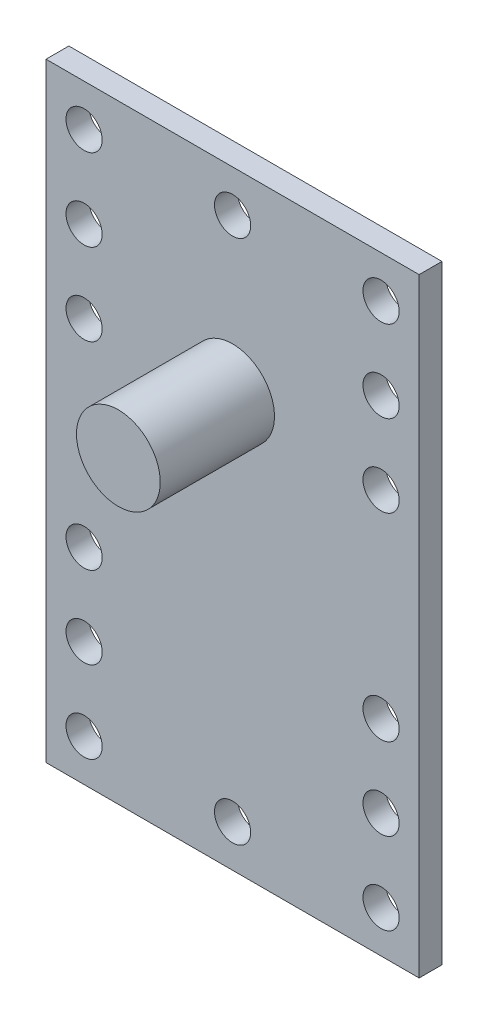
ISO-10303-21;
HEADER;
FILE_DESCRIPTION(('STEP AP214'),'2;1');
FILE_NAME('part.step','',(''),(''),'','','');
FILE_SCHEMA(('AUTOMOTIVE_DESIGN { 1 0 10303 214 1 1 1 1 }'));
ENDSEC;
DATA;
#1=APPLICATION_CONTEXT('core data for automotive mechanical design processes');
#2=APPLICATION_PROTOCOL_DEFINITION('international standard','automotive_design',2000,#1);
#3=PRODUCT_CONTEXT('',#1,'mechanical');
#4=PRODUCT('Part','Part','',(#3));
#5=PRODUCT_RELATED_PRODUCT_CATEGORY('part','',(#4));
#6=PRODUCT_DEFINITION_FORMATION('','',#4);
#7=PRODUCT_DEFINITION_CONTEXT('part definition',#1,'design');
#8=PRODUCT_DEFINITION('design','',#6,#7);
#9=PRODUCT_DEFINITION_SHAPE('','',#8);
#10=(LENGTH_UNIT() NAMED_UNIT(*) SI_UNIT(.MILLI.,.METRE.));
#11=(NAMED_UNIT(*) PLANE_ANGLE_UNIT() SI_UNIT($,.RADIAN.));
#12=(NAMED_UNIT(*) SI_UNIT($,.STERADIAN.) SOLID_ANGLE_UNIT());
#13=UNCERTAINTY_MEASURE_WITH_UNIT(LENGTH_MEASURE(1.E-05),#10,'distance_accuracy_value','');
#14=(GEOMETRIC_REPRESENTATION_CONTEXT(3) GLOBAL_UNCERTAINTY_ASSIGNED_CONTEXT((#13)) GLOBAL_UNIT_ASSIGNED_CONTEXT((#10,
#11,#12)) REPRESENTATION_CONTEXT('',''));
#15=CARTESIAN_POINT('',(0.,0.,0.));
#16=DIRECTION('',(0.,0.,1.));
#17=DIRECTION('',(1.,0.,0.));
#18=AXIS2_PLACEMENT_3D('',#15,#16,#17);
#19=CARTESIAN_POINT('',(0.,0.,0.));
#20=DIRECTION('',(0.,0.,-1.));
#21=DIRECTION('',(-1.,0.,0.));
#22=AXIS2_PLACEMENT_3D('',#19,#20,#21);
#23=PLANE('',#22);
#24=CARTESIAN_POINT('',(-7.8,5.2,0.));
#25=DIRECTION('',(0.,0.,1.));
#26=DIRECTION('',(-1.,0.,0.));
#27=AXIS2_PLACEMENT_3D('',#24,#25,#26);
#28=CIRCLE('',#27,0.949999999999999);
#29=CARTESIAN_POINT('',(-8.75,5.2,0.));
#30=VERTEX_POINT('',#29);
#31=EDGE_CURVE('E150',#30,#30,#28,.T.);
#32=ORIENTED_EDGE('',*,*,#31,.F.);
#33=EDGE_LOOP('',(#32));
#34=FACE_BOUND('',#33,.T.);
#35=CARTESIAN_POINT('',(-7.8,13.8,0.));
#36=DIRECTION('',(0.,0.,1.));
#37=DIRECTION('',(-1.,0.,0.));
#38=AXIS2_PLACEMENT_3D('',#35,#36,#37);
#39=CIRCLE('',#38,0.949999999999999);
#40=CARTESIAN_POINT('',(-8.75,13.8,0.));
#41=VERTEX_POINT('',#40);
#42=EDGE_CURVE('E164',#41,#41,#39,.T.);
#43=ORIENTED_EDGE('',*,*,#42,.F.);
#44=EDGE_LOOP('',(#43));
#45=FACE_BOUND('',#44,.T.);
#46=CARTESIAN_POINT('',(7.8,5.2,0.));
#47=DIRECTION('',(0.,0.,-1.));
#48=DIRECTION('',(1.,0.,0.));
#49=AXIS2_PLACEMENT_3D('',#46,#47,#48);
#50=CIRCLE('',#49,0.949999999999999);
#51=CARTESIAN_POINT('',(8.75,5.2,0.));
#52=VERTEX_POINT('',#51);
#53=EDGE_CURVE('E168',#52,#52,#50,.T.);
#54=ORIENTED_EDGE('',*,*,#53,.T.);
#55=EDGE_LOOP('',(#54));
#56=FACE_BOUND('',#55,.T.);
#57=CARTESIAN_POINT('',(7.8,9.5,0.));
#58=DIRECTION('',(0.,0.,-1.));
#59=DIRECTION('',(1.,0.,0.));
#60=AXIS2_PLACEMENT_3D('',#57,#58,#59);
#61=CIRCLE('',#60,0.949999999999999);
#62=CARTESIAN_POINT('',(8.75,9.5,0.));
#63=VERTEX_POINT('',#62);
#64=EDGE_CURVE('E172',#63,#63,#61,.T.);
#65=ORIENTED_EDGE('',*,*,#64,.T.);
#66=EDGE_LOOP('',(#65));
#67=FACE_BOUND('',#66,.T.);
#68=CARTESIAN_POINT('',(7.8,13.8,0.));
#69=DIRECTION('',(0.,0.,-1.));
#70=DIRECTION('',(1.,0.,0.));
#71=AXIS2_PLACEMENT_3D('',#68,#69,#70);
#72=CIRCLE('',#71,0.949999999999999);
#73=CARTESIAN_POINT('',(8.75,13.8,0.));
#74=VERTEX_POINT('',#73);
#75=EDGE_CURVE('E176',#74,#74,#72,.T.);
#76=ORIENTED_EDGE('',*,*,#75,.T.);
#77=EDGE_LOOP('',(#76));
#78=FACE_BOUND('',#77,.T.);
#79=CARTESIAN_POINT('',(7.8,-9.5,0.));
#80=DIRECTION('',(0.,0.,1.));
#81=DIRECTION('',(1.,0.,0.));
#82=AXIS2_PLACEMENT_3D('',#79,#80,#81);
#83=CIRCLE('',#82,0.949999999999999);
#84=CARTESIAN_POINT('',(8.75,-9.5,0.));
#85=VERTEX_POINT('',#84);
#86=EDGE_CURVE('E186',#85,#85,#83,.T.);
#87=ORIENTED_EDGE('',*,*,#86,.F.);
#88=EDGE_LOOP('',(#87));
#89=FACE_BOUND('',#88,.T.);
#90=CARTESIAN_POINT('',(-7.8,-5.2,0.));
#91=DIRECTION('',(0.,0.,-1.));
#92=DIRECTION('',(-1.,0.,0.));
#93=AXIS2_PLACEMENT_3D('',#90,#91,#92);
#94=CIRCLE('',#93,0.949999999999999);
#95=CARTESIAN_POINT('',(-8.75,-5.2,0.));
#96=VERTEX_POINT('',#95);
#97=EDGE_CURVE('E114',#96,#96,#94,.T.);
#98=ORIENTED_EDGE('',*,*,#97,.T.);
#99=EDGE_LOOP('',(#98));
#100=FACE_BOUND('',#99,.T.);
#101=DIRECTION('',(0.,1.,0.));
#102=VECTOR('',#101,1.);
#103=CARTESIAN_POINT('',(9.8,-16.,0.));
#104=LINE('',#103,#102);
#105=CARTESIAN_POINT('',(9.8,-16.,0.));
#106=VERTEX_POINT('',#105);
#107=CARTESIAN_POINT('',(9.8,16.,0.));
#108=VERTEX_POINT('',#107);
#109=EDGE_CURVE('E104',#106,#108,#104,.T.);
#110=ORIENTED_EDGE('',*,*,#109,.T.);
#111=DIRECTION('',(-1.,0.,0.));
#112=VECTOR('',#111,1.);
#113=CARTESIAN_POINT('',(-9.8,16.,0.));
#114=LINE('',#113,#112);
#115=CARTESIAN_POINT('',(-9.8,16.,0.));
#116=VERTEX_POINT('',#115);
#117=EDGE_CURVE('E107',#108,#116,#114,.T.);
#118=ORIENTED_EDGE('',*,*,#117,.T.);
#119=DIRECTION('',(0.,-1.,0.));
#120=VECTOR('',#119,1.);
#121=CARTESIAN_POINT('',(-9.8,-16.,0.));
#122=LINE('',#121,#120);
#123=CARTESIAN_POINT('',(-9.8,-16.,0.));
#124=VERTEX_POINT('',#123);
#125=EDGE_CURVE('E87',#116,#124,#122,.T.);
#126=ORIENTED_EDGE('',*,*,#125,.T.);
#127=DIRECTION('',(1.,0.,0.));
#128=VECTOR('',#127,1.);
#129=CARTESIAN_POINT('',(-9.8,-16.,0.));
#130=LINE('',#129,#128);
#131=EDGE_CURVE('E99',#124,#106,#130,.T.);
#132=ORIENTED_EDGE('',*,*,#131,.T.);
#133=EDGE_LOOP('',(#110,#118,#126,#132));
#134=FACE_BOUND('',#133,.T.);
#135=CARTESIAN_POINT('',(0.,13.8,0.));
#136=DIRECTION('',(0.,0.,-1.));
#137=DIRECTION('',(-1.,0.,0.));
#138=AXIS2_PLACEMENT_3D('',#135,#136,#137);
#139=CIRCLE('',#138,0.95);
#140=CARTESIAN_POINT('',(-0.95,13.8,0.));
#141=VERTEX_POINT('',#140);
#142=EDGE_CURVE('E108',#141,#141,#139,.T.);
#143=ORIENTED_EDGE('',*,*,#142,.T.);
#144=EDGE_LOOP('',(#143));
#145=FACE_BOUND('',#144,.T.);
#146=CARTESIAN_POINT('',(0.,-13.8,0.));
#147=DIRECTION('',(0.,0.,-1.));
#148=DIRECTION('',(-1.,0.,0.));
#149=AXIS2_PLACEMENT_3D('',#146,#147,#148);
#150=CIRCLE('',#149,0.949999999999999);
#151=CARTESIAN_POINT('',(-0.949999999999999,-13.8,0.));
#152=VERTEX_POINT('',#151);
#153=EDGE_CURVE('E209',#152,#152,#150,.T.);
#154=ORIENTED_EDGE('',*,*,#153,.T.);
#155=EDGE_LOOP('',(#154));
#156=FACE_BOUND('',#155,.T.);
#157=CARTESIAN_POINT('',(-7.8,-13.8,0.));
#158=DIRECTION('',(0.,0.,-1.));
#159=DIRECTION('',(-1.,0.,0.));
#160=AXIS2_PLACEMENT_3D('',#157,#158,#159);
#161=CIRCLE('',#160,0.949999999999999);
#162=CARTESIAN_POINT('',(-8.75,-13.8,0.));
#163=VERTEX_POINT('',#162);
#164=EDGE_CURVE('E203',#163,#163,#161,.T.);
#165=ORIENTED_EDGE('',*,*,#164,.T.);
#166=EDGE_LOOP('',(#165));
#167=FACE_BOUND('',#166,.T.);
#168=CARTESIAN_POINT('',(-7.8,-9.5,0.));
#169=DIRECTION('',(0.,0.,-1.));
#170=DIRECTION('',(-1.,0.,0.));
#171=AXIS2_PLACEMENT_3D('',#168,#169,#170);
#172=CIRCLE('',#171,0.949999999999999);
#173=CARTESIAN_POINT('',(-8.75,-9.5,0.));
#174=VERTEX_POINT('',#173);
#175=EDGE_CURVE('E194',#174,#174,#172,.T.);
#176=ORIENTED_EDGE('',*,*,#175,.T.);
#177=EDGE_LOOP('',(#176));
#178=FACE_BOUND('',#177,.T.);
#179=CARTESIAN_POINT('',(7.8,-13.8,0.));
#180=DIRECTION('',(0.,0.,1.));
#181=DIRECTION('',(1.,0.,0.));
#182=AXIS2_PLACEMENT_3D('',#179,#180,#181);
#183=CIRCLE('',#182,0.949999999999999);
#184=CARTESIAN_POINT('',(8.75,-13.8,0.));
#185=VERTEX_POINT('',#184);
#186=EDGE_CURVE('E191',#185,#185,#183,.T.);
#187=ORIENTED_EDGE('',*,*,#186,.F.);
#188=EDGE_LOOP('',(#187));
#189=FACE_BOUND('',#188,.T.);
#190=CARTESIAN_POINT('',(7.8,-5.2,0.));
#191=DIRECTION('',(0.,0.,1.));
#192=DIRECTION('',(1.,0.,0.));
#193=AXIS2_PLACEMENT_3D('',#190,#191,#192);
#194=CIRCLE('',#193,0.949999999999999);
#195=CARTESIAN_POINT('',(8.75,-5.2,0.));
#196=VERTEX_POINT('',#195);
#197=EDGE_CURVE('E181',#196,#196,#194,.T.);
#198=ORIENTED_EDGE('',*,*,#197,.F.);
#199=EDGE_LOOP('',(#198));
#200=FACE_BOUND('',#199,.T.);
#201=CARTESIAN_POINT('',(-7.8,9.5,0.));
#202=DIRECTION('',(0.,0.,1.));
#203=DIRECTION('',(-1.,0.,0.));
#204=AXIS2_PLACEMENT_3D('',#201,#202,#203);
#205=CIRCLE('',#204,0.949999999999999);
#206=CARTESIAN_POINT('',(-8.75,9.5,0.));
#207=VERTEX_POINT('',#206);
#208=EDGE_CURVE('E159',#207,#207,#205,.T.);
#209=ORIENTED_EDGE('',*,*,#208,.F.);
#210=EDGE_LOOP('',(#209));
#211=FACE_BOUND('',#210,.T.);
#212=CARTESIAN_POINT('',(0.,5.75,0.));
#213=DIRECTION('',(0.,0.,-1.));
#214=DIRECTION('',(-1.,0.,0.));
#215=AXIS2_PLACEMENT_3D('',#212,#213,#214);
#216=CIRCLE('',#215,2.2);
#217=CARTESIAN_POINT('',(-2.2,5.75,0.));
#218=VERTEX_POINT('',#217);
#219=EDGE_CURVE('E11',#218,#218,#216,.F.);
#220=ORIENTED_EDGE('',*,*,#219,.F.);
#221=EDGE_LOOP('',(#220));
#222=FACE_BOUND('',#221,.T.);
#223=ADVANCED_FACE('F34',(#34,#45,#56,#67,#78,#89,#100,#134,#145,#156,#167,#178,#189,#200,#211,
#222),#23,.F.);
#224=CARTESIAN_POINT('',(0.,0.,-1.2));
#225=DIRECTION('',(0.,0.,-1.));
#226=DIRECTION('',(-1.,0.,0.));
#227=AXIS2_PLACEMENT_3D('',#224,#225,#226);
#228=PLANE('',#227);
#229=CARTESIAN_POINT('',(-7.8,9.5,-1.2));
#230=DIRECTION('',(0.,0.,1.));
#231=DIRECTION('',(-1.,0.,0.));
#232=AXIS2_PLACEMENT_3D('',#229,#230,#231);
#233=CIRCLE('',#232,0.949999999999999);
#234=CARTESIAN_POINT('',(-8.75,9.5,-1.2));
#235=VERTEX_POINT('',#234);
#236=EDGE_CURVE('E154',#235,#235,#233,.T.);
#237=ORIENTED_EDGE('',*,*,#236,.T.);
#238=EDGE_LOOP('',(#237));
#239=FACE_BOUND('',#238,.T.);
#240=CARTESIAN_POINT('',(7.8,-5.2,-1.2));
#241=DIRECTION('',(0.,0.,1.));
#242=DIRECTION('',(1.,0.,0.));
#243=AXIS2_PLACEMENT_3D('',#240,#241,#242);
#244=CIRCLE('',#243,0.949999999999999);
#245=CARTESIAN_POINT('',(8.75,-5.2,-1.2));
#246=VERTEX_POINT('',#245);
#247=EDGE_CURVE('E179',#246,#246,#244,.T.);
#248=ORIENTED_EDGE('',*,*,#247,.T.);
#249=EDGE_LOOP('',(#248));
#250=FACE_BOUND('',#249,.T.);
#251=CARTESIAN_POINT('',(7.8,-13.8,-1.2));
#252=DIRECTION('',(0.,0.,1.));
#253=DIRECTION('',(1.,0.,0.));
#254=AXIS2_PLACEMENT_3D('',#251,#252,#253);
#255=CIRCLE('',#254,0.949999999999999);
#256=CARTESIAN_POINT('',(8.75,-13.8,-1.2));
#257=VERTEX_POINT('',#256);
#258=EDGE_CURVE('E189',#257,#257,#255,.T.);
#259=ORIENTED_EDGE('',*,*,#258,.T.);
#260=EDGE_LOOP('',(#259));
#261=FACE_BOUND('',#260,.T.);
#262=CARTESIAN_POINT('',(-7.8,-9.5,-1.2));
#263=DIRECTION('',(0.,0.,-1.));
#264=DIRECTION('',(-1.,0.,0.));
#265=AXIS2_PLACEMENT_3D('',#262,#263,#264);
#266=CIRCLE('',#265,0.949999999999999);
#267=CARTESIAN_POINT('',(-8.75,-9.5,-1.2));
#268=VERTEX_POINT('',#267);
#269=EDGE_CURVE('E199',#268,#268,#266,.T.);
#270=ORIENTED_EDGE('',*,*,#269,.F.);
#271=EDGE_LOOP('',(#270));
#272=FACE_BOUND('',#271,.T.);
#273=CARTESIAN_POINT('',(-7.8,-13.8,-1.2));
#274=DIRECTION('',(0.,0.,-1.));
#275=DIRECTION('',(-1.,0.,0.));
#276=AXIS2_PLACEMENT_3D('',#273,#274,#275);
#277=CIRCLE('',#276,0.949999999999999);
#278=CARTESIAN_POINT('',(-8.75,-13.8,-1.2));
#279=VERTEX_POINT('',#278);
#280=EDGE_CURVE('E202',#279,#279,#277,.T.);
#281=ORIENTED_EDGE('',*,*,#280,.F.);
#282=EDGE_LOOP('',(#281));
#283=FACE_BOUND('',#282,.T.);
#284=CARTESIAN_POINT('',(0.,-13.8,-1.2));
#285=DIRECTION('',(0.,0.,-1.));
#286=DIRECTION('',(-1.,0.,0.));
#287=AXIS2_PLACEMENT_3D('',#284,#285,#286);
#288=CIRCLE('',#287,0.949999999999999);
#289=CARTESIAN_POINT('',(-0.949999999999999,-13.8,-1.2));
#290=VERTEX_POINT('',#289);
#291=EDGE_CURVE('E206',#290,#290,#288,.T.);
#292=ORIENTED_EDGE('',*,*,#291,.F.);
#293=EDGE_LOOP('',(#292));
#294=FACE_BOUND('',#293,.T.);
#295=CARTESIAN_POINT('',(0.,13.8,-1.2));
#296=DIRECTION('',(0.,0.,-1.));
#297=DIRECTION('',(-1.,0.,0.));
#298=AXIS2_PLACEMENT_3D('',#295,#296,#297);
#299=CIRCLE('',#298,0.95);
#300=CARTESIAN_POINT('',(-0.95,13.8,-1.2));
#301=VERTEX_POINT('',#300);
#302=EDGE_CURVE('E212',#301,#301,#299,.T.);
#303=ORIENTED_EDGE('',*,*,#302,.F.);
#304=EDGE_LOOP('',(#303));
#305=FACE_BOUND('',#304,.T.);
#306=DIRECTION('',(0.,1.,0.));
#307=VECTOR('',#306,1.);
#308=CARTESIAN_POINT('',(9.8,-16.,-1.2));
#309=LINE('',#308,#307);
#310=CARTESIAN_POINT('',(9.8,-16.,-1.2));
#311=VERTEX_POINT('',#310);
#312=CARTESIAN_POINT('',(9.8,16.,-1.2));
#313=VERTEX_POINT('',#312);
#314=EDGE_CURVE('E97',#311,#313,#309,.T.);
#315=ORIENTED_EDGE('',*,*,#314,.F.);
#316=DIRECTION('',(1.,0.,0.));
#317=VECTOR('',#316,1.);
#318=CARTESIAN_POINT('',(-9.8,-16.,-1.2));
#319=LINE('',#318,#317);
#320=CARTESIAN_POINT('',(-9.8,-16.,-1.2));
#321=VERTEX_POINT('',#320);
#322=EDGE_CURVE('E94',#321,#311,#319,.T.);
#323=ORIENTED_EDGE('',*,*,#322,.F.);
#324=DIRECTION('',(0.,-1.,0.));
#325=VECTOR('',#324,1.);
#326=CARTESIAN_POINT('',(-9.8,-16.,-1.2));
#327=LINE('',#326,#325);
#328=CARTESIAN_POINT('',(-9.8,16.,-1.2));
#329=VERTEX_POINT('',#328);
#330=EDGE_CURVE('E85',#329,#321,#327,.T.);
#331=ORIENTED_EDGE('',*,*,#330,.F.);
#332=DIRECTION('',(-1.,0.,0.));
#333=VECTOR('',#332,1.);
#334=CARTESIAN_POINT('',(-9.8,16.,-1.2));
#335=LINE('',#334,#333);
#336=EDGE_CURVE('E93',#313,#329,#335,.T.);
#337=ORIENTED_EDGE('',*,*,#336,.F.);
#338=EDGE_LOOP('',(#315,#323,#331,#337));
#339=FACE_BOUND('',#338,.T.);
#340=CARTESIAN_POINT('',(-7.8,-5.2,-1.2));
#341=DIRECTION('',(0.,0.,-1.));
#342=DIRECTION('',(-1.,0.,0.));
#343=AXIS2_PLACEMENT_3D('',#340,#341,#342);
#344=CIRCLE('',#343,0.949999999999999);
#345=CARTESIAN_POINT('',(-8.75,-5.2,-1.2));
#346=VERTEX_POINT('',#345);
#347=EDGE_CURVE('E43',#346,#346,#344,.T.);
#348=ORIENTED_EDGE('',*,*,#347,.F.);
#349=EDGE_LOOP('',(#348));
#350=FACE_BOUND('',#349,.T.);
#351=CARTESIAN_POINT('',(7.8,-9.5,-1.2));
#352=DIRECTION('',(0.,0.,1.));
#353=DIRECTION('',(1.,0.,0.));
#354=AXIS2_PLACEMENT_3D('',#351,#352,#353);
#355=CIRCLE('',#354,0.949999999999999);
#356=CARTESIAN_POINT('',(8.75,-9.5,-1.2));
#357=VERTEX_POINT('',#356);
#358=EDGE_CURVE('E129',#357,#357,#355,.T.);
#359=ORIENTED_EDGE('',*,*,#358,.T.);
#360=EDGE_LOOP('',(#359));
#361=FACE_BOUND('',#360,.T.);
#362=CARTESIAN_POINT('',(7.8,13.8,-1.2));
#363=DIRECTION('',(0.,0.,-1.));
#364=DIRECTION('',(1.,0.,0.));
#365=AXIS2_PLACEMENT_3D('',#362,#363,#364);
#366=CIRCLE('',#365,0.949999999999999);
#367=CARTESIAN_POINT('',(8.75,13.8,-1.2));
#368=VERTEX_POINT('',#367);
#369=EDGE_CURVE('E133',#368,#368,#366,.T.);
#370=ORIENTED_EDGE('',*,*,#369,.F.);
#371=EDGE_LOOP('',(#370));
#372=FACE_BOUND('',#371,.T.);
#373=CARTESIAN_POINT('',(7.8,9.5,-1.2));
#374=DIRECTION('',(0.,0.,-1.));
#375=DIRECTION('',(1.,0.,0.));
#376=AXIS2_PLACEMENT_3D('',#373,#374,#375);
#377=CIRCLE('',#376,0.949999999999999);
#378=CARTESIAN_POINT('',(8.75,9.5,-1.2));
#379=VERTEX_POINT('',#378);
#380=EDGE_CURVE('E137',#379,#379,#377,.T.);
#381=ORIENTED_EDGE('',*,*,#380,.F.);
#382=EDGE_LOOP('',(#381));
#383=FACE_BOUND('',#382,.T.);
#384=CARTESIAN_POINT('',(7.8,5.2,-1.2));
#385=DIRECTION('',(0.,0.,-1.));
#386=DIRECTION('',(1.,0.,0.));
#387=AXIS2_PLACEMENT_3D('',#384,#385,#386);
#388=CIRCLE('',#387,0.949999999999999);
#389=CARTESIAN_POINT('',(8.75,5.2,-1.2));
#390=VERTEX_POINT('',#389);
#391=EDGE_CURVE('E141',#390,#390,#388,.T.);
#392=ORIENTED_EDGE('',*,*,#391,.F.);
#393=EDGE_LOOP('',(#392));
#394=FACE_BOUND('',#393,.T.);
#395=CARTESIAN_POINT('',(-7.8,13.8,-1.2));
#396=DIRECTION('',(0.,0.,1.));
#397=DIRECTION('',(-1.,0.,0.));
#398=AXIS2_PLACEMENT_3D('',#395,#396,#397);
#399=CIRCLE('',#398,0.949999999999999);
#400=CARTESIAN_POINT('',(-8.75,13.8,-1.2));
#401=VERTEX_POINT('',#400);
#402=EDGE_CURVE('E145',#401,#401,#399,.T.);
#403=ORIENTED_EDGE('',*,*,#402,.T.);
#404=EDGE_LOOP('',(#403));
#405=FACE_BOUND('',#404,.T.);
#406=CARTESIAN_POINT('',(-7.8,5.2,-1.2));
#407=DIRECTION('',(0.,0.,1.));
#408=DIRECTION('',(-1.,0.,0.));
#409=AXIS2_PLACEMENT_3D('',#406,#407,#408);
#410=CIRCLE('',#409,0.949999999999999);
#411=CARTESIAN_POINT('',(-8.75,5.2,-1.2));
#412=VERTEX_POINT('',#411);
#413=EDGE_CURVE('E148',#412,#412,#410,.T.);
#414=ORIENTED_EDGE('',*,*,#413,.T.);
#415=EDGE_LOOP('',(#414));
#416=FACE_BOUND('',#415,.T.);
#417=ADVANCED_FACE('F91',(#239,#250,#261,#272,#283,#294,#305,#339,#350,#361,#372,#383,#394,#405,
#416),#228,.T.);
#418=CARTESIAN_POINT('',(9.8,-16.,-1.2));
#419=DIRECTION('',(1.,0.,0.));
#420=DIRECTION('',(0.,0.,-1.));
#421=AXIS2_PLACEMENT_3D('',#418,#419,#420);
#422=PLANE('',#421);
#423=ORIENTED_EDGE('',*,*,#109,.F.);
#424=DIRECTION('',(0.,0.,1.));
#425=VECTOR('',#424,1.);
#426=CARTESIAN_POINT('',(9.8,-16.,-1.2));
#427=LINE('',#426,#425);
#428=EDGE_CURVE('E51',#311,#106,#427,.T.);
#429=ORIENTED_EDGE('',*,*,#428,.F.);
#430=ORIENTED_EDGE('',*,*,#314,.T.);
#431=DIRECTION('',(0.,0.,1.));
#432=VECTOR('',#431,1.);
#433=CARTESIAN_POINT('',(9.8,16.,-1.2));
#434=LINE('',#433,#432);
#435=EDGE_CURVE('E79',#313,#108,#434,.T.);
#436=ORIENTED_EDGE('',*,*,#435,.T.);
#437=EDGE_LOOP('',(#423,#429,#430,#436));
#438=FACE_BOUND('',#437,.T.);
#439=ADVANCED_FACE('F123',(#438),#422,.T.);
#440=CARTESIAN_POINT('',(-9.8,-16.,-1.2));
#441=DIRECTION('',(0.,-1.,0.));
#442=DIRECTION('',(0.,0.,-1.));
#443=AXIS2_PLACEMENT_3D('',#440,#441,#442);
#444=PLANE('',#443);
#445=ORIENTED_EDGE('',*,*,#131,.F.);
#446=DIRECTION('',(0.,0.,1.));
#447=VECTOR('',#446,1.);
#448=CARTESIAN_POINT('',(-9.8,-16.,-1.2));
#449=LINE('',#448,#447);
#450=EDGE_CURVE('E68',#321,#124,#449,.T.);
#451=ORIENTED_EDGE('',*,*,#450,.F.);
#452=ORIENTED_EDGE('',*,*,#322,.T.);
#453=ORIENTED_EDGE('',*,*,#428,.T.);
#454=EDGE_LOOP('',(#445,#451,#452,#453));
#455=FACE_BOUND('',#454,.T.);
#456=ADVANCED_FACE('F242',(#455),#444,.T.);
#457=CARTESIAN_POINT('',(-9.8,-16.,-1.2));
#458=DIRECTION('',(-1.,0.,0.));
#459=DIRECTION('',(0.,0.,1.));
#460=AXIS2_PLACEMENT_3D('',#457,#458,#459);
#461=PLANE('',#460);
#462=ORIENTED_EDGE('',*,*,#125,.F.);
#463=DIRECTION('',(0.,0.,1.));
#464=VECTOR('',#463,1.);
#465=CARTESIAN_POINT('',(-9.8,16.,-1.2));
#466=LINE('',#465,#464);
#467=EDGE_CURVE('E82',#329,#116,#466,.T.);
#468=ORIENTED_EDGE('',*,*,#467,.F.);
#469=ORIENTED_EDGE('',*,*,#330,.T.);
#470=ORIENTED_EDGE('',*,*,#450,.T.);
#471=EDGE_LOOP('',(#462,#468,#469,#470));
#472=FACE_BOUND('',#471,.T.);
#473=ADVANCED_FACE('F84',(#472),#461,.T.);
#474=CARTESIAN_POINT('',(-9.8,16.,-1.2));
#475=DIRECTION('',(0.,1.,0.));
#476=DIRECTION('',(0.,0.,1.));
#477=AXIS2_PLACEMENT_3D('',#474,#475,#476);
#478=PLANE('',#477);
#479=ORIENTED_EDGE('',*,*,#117,.F.);
#480=ORIENTED_EDGE('',*,*,#435,.F.);
#481=ORIENTED_EDGE('',*,*,#336,.T.);
#482=ORIENTED_EDGE('',*,*,#467,.T.);
#483=EDGE_LOOP('',(#479,#480,#481,#482));
#484=FACE_BOUND('',#483,.T.);
#485=ADVANCED_FACE('F96',(#484),#478,.T.);
#486=CARTESIAN_POINT('',(0.,13.8,0.));
#487=DIRECTION('',(0.,0.,-1.));
#488=DIRECTION('',(-1.,0.,0.));
#489=AXIS2_PLACEMENT_3D('',#486,#487,#488);
#490=CYLINDRICAL_SURFACE('',#489,0.95);
#491=ORIENTED_EDGE('',*,*,#142,.F.);
#492=EDGE_LOOP('',(#491));
#493=FACE_BOUND('',#492,.T.);
#494=ORIENTED_EDGE('',*,*,#302,.T.);
#495=EDGE_LOOP('',(#494));
#496=FACE_BOUND('',#495,.T.);
#497=ADVANCED_FACE('F219',(#493,#496),#490,.F.);
#498=CARTESIAN_POINT('',(0.,-13.8,0.));
#499=DIRECTION('',(0.,0.,-1.));
#500=DIRECTION('',(-1.,0.,0.));
#501=AXIS2_PLACEMENT_3D('',#498,#499,#500);
#502=CYLINDRICAL_SURFACE('',#501,0.949999999999999);
#503=ORIENTED_EDGE('',*,*,#153,.F.);
#504=EDGE_LOOP('',(#503));
#505=FACE_BOUND('',#504,.T.);
#506=ORIENTED_EDGE('',*,*,#291,.T.);
#507=EDGE_LOOP('',(#506));
#508=FACE_BOUND('',#507,.T.);
#509=ADVANCED_FACE('F222',(#505,#508),#502,.F.);
#510=CARTESIAN_POINT('',(-7.8,-13.8,0.));
#511=DIRECTION('',(0.,0.,-1.));
#512=DIRECTION('',(-1.,0.,0.));
#513=AXIS2_PLACEMENT_3D('',#510,#511,#512);
#514=CYLINDRICAL_SURFACE('',#513,0.949999999999999);
#515=ORIENTED_EDGE('',*,*,#164,.F.);
#516=EDGE_LOOP('',(#515));
#517=FACE_BOUND('',#516,.T.);
#518=ORIENTED_EDGE('',*,*,#280,.T.);
#519=EDGE_LOOP('',(#518));
#520=FACE_BOUND('',#519,.T.);
#521=ADVANCED_FACE('F229',(#517,#520),#514,.F.);
#522=CARTESIAN_POINT('',(-7.8,-9.5,0.));
#523=DIRECTION('',(0.,0.,-1.));
#524=DIRECTION('',(-1.,0.,0.));
#525=AXIS2_PLACEMENT_3D('',#522,#523,#524);
#526=CYLINDRICAL_SURFACE('',#525,0.949999999999999);
#527=ORIENTED_EDGE('',*,*,#175,.F.);
#528=EDGE_LOOP('',(#527));
#529=FACE_BOUND('',#528,.T.);
#530=ORIENTED_EDGE('',*,*,#269,.T.);
#531=EDGE_LOOP('',(#530));
#532=FACE_BOUND('',#531,.T.);
#533=ADVANCED_FACE('F314',(#529,#532),#526,.F.);
#534=CARTESIAN_POINT('',(-7.8,-5.2,0.));
#535=DIRECTION('',(0.,0.,-1.));
#536=DIRECTION('',(-1.,0.,0.));
#537=AXIS2_PLACEMENT_3D('',#534,#535,#536);
#538=CYLINDRICAL_SURFACE('',#537,0.949999999999999);
#539=ORIENTED_EDGE('',*,*,#97,.F.);
#540=EDGE_LOOP('',(#539));
#541=FACE_BOUND('',#540,.T.);
#542=ORIENTED_EDGE('',*,*,#347,.T.);
#543=EDGE_LOOP('',(#542));
#544=FACE_BOUND('',#543,.T.);
#545=ADVANCED_FACE('F36',(#541,#544),#538,.F.);
#546=CARTESIAN_POINT('',(7.8,-13.8,0.));
#547=DIRECTION('',(0.,0.,-1.));
#548=DIRECTION('',(-1.,0.,0.));
#549=AXIS2_PLACEMENT_3D('',#546,#547,#548);
#550=CYLINDRICAL_SURFACE('',#549,0.949999999999999);
#551=ORIENTED_EDGE('',*,*,#186,.T.);
#552=EDGE_LOOP('',(#551));
#553=FACE_BOUND('',#552,.T.);
#554=ORIENTED_EDGE('',*,*,#258,.F.);
#555=EDGE_LOOP('',(#554));
#556=FACE_BOUND('',#555,.T.);
#557=ADVANCED_FACE('F309',(#553,#556),#550,.F.);
#558=CARTESIAN_POINT('',(7.8,-9.5,0.));
#559=DIRECTION('',(0.,0.,-1.));
#560=DIRECTION('',(-1.,0.,0.));
#561=AXIS2_PLACEMENT_3D('',#558,#559,#560);
#562=CYLINDRICAL_SURFACE('',#561,0.949999999999999);
#563=ORIENTED_EDGE('',*,*,#86,.T.);
#564=EDGE_LOOP('',(#563));
#565=FACE_BOUND('',#564,.T.);
#566=ORIENTED_EDGE('',*,*,#358,.F.);
#567=EDGE_LOOP('',(#566));
#568=FACE_BOUND('',#567,.T.);
#569=ADVANCED_FACE('F305',(#565,#568),#562,.F.);
#570=CARTESIAN_POINT('',(7.8,-5.2,0.));
#571=DIRECTION('',(0.,0.,-1.));
#572=DIRECTION('',(-1.,0.,0.));
#573=AXIS2_PLACEMENT_3D('',#570,#571,#572);
#574=CYLINDRICAL_SURFACE('',#573,0.949999999999999);
#575=ORIENTED_EDGE('',*,*,#197,.T.);
#576=EDGE_LOOP('',(#575));
#577=FACE_BOUND('',#576,.T.);
#578=ORIENTED_EDGE('',*,*,#247,.F.);
#579=EDGE_LOOP('',(#578));
#580=FACE_BOUND('',#579,.T.);
#581=ADVANCED_FACE('F301',(#577,#580),#574,.F.);
#582=CARTESIAN_POINT('',(7.8,13.8,0.));
#583=DIRECTION('',(0.,0.,-1.));
#584=DIRECTION('',(-1.,0.,0.));
#585=AXIS2_PLACEMENT_3D('',#582,#583,#584);
#586=CYLINDRICAL_SURFACE('',#585,0.949999999999999);
#587=ORIENTED_EDGE('',*,*,#75,.F.);
#588=EDGE_LOOP('',(#587));
#589=FACE_BOUND('',#588,.T.);
#590=ORIENTED_EDGE('',*,*,#369,.T.);
#591=EDGE_LOOP('',(#590));
#592=FACE_BOUND('',#591,.T.);
#593=ADVANCED_FACE('F297',(#589,#592),#586,.F.);
#594=CARTESIAN_POINT('',(7.8,9.5,0.));
#595=DIRECTION('',(0.,0.,-1.));
#596=DIRECTION('',(-1.,0.,0.));
#597=AXIS2_PLACEMENT_3D('',#594,#595,#596);
#598=CYLINDRICAL_SURFACE('',#597,0.949999999999999);
#599=ORIENTED_EDGE('',*,*,#64,.F.);
#600=EDGE_LOOP('',(#599));
#601=FACE_BOUND('',#600,.T.);
#602=ORIENTED_EDGE('',*,*,#380,.T.);
#603=EDGE_LOOP('',(#602));
#604=FACE_BOUND('',#603,.T.);
#605=ADVANCED_FACE('F293',(#601,#604),#598,.F.);
#606=CARTESIAN_POINT('',(7.8,5.2,0.));
#607=DIRECTION('',(0.,0.,-1.));
#608=DIRECTION('',(-1.,0.,0.));
#609=AXIS2_PLACEMENT_3D('',#606,#607,#608);
#610=CYLINDRICAL_SURFACE('',#609,0.949999999999999);
#611=ORIENTED_EDGE('',*,*,#53,.F.);
#612=EDGE_LOOP('',(#611));
#613=FACE_BOUND('',#612,.T.);
#614=ORIENTED_EDGE('',*,*,#391,.T.);
#615=EDGE_LOOP('',(#614));
#616=FACE_BOUND('',#615,.T.);
#617=ADVANCED_FACE('F289',(#613,#616),#610,.F.);
#618=CARTESIAN_POINT('',(-7.8,13.8,0.));
#619=DIRECTION('',(0.,0.,-1.));
#620=DIRECTION('',(-1.,0.,0.));
#621=AXIS2_PLACEMENT_3D('',#618,#619,#620);
#622=CYLINDRICAL_SURFACE('',#621,0.949999999999999);
#623=ORIENTED_EDGE('',*,*,#42,.T.);
#624=EDGE_LOOP('',(#623));
#625=FACE_BOUND('',#624,.T.);
#626=ORIENTED_EDGE('',*,*,#402,.F.);
#627=EDGE_LOOP('',(#626));
#628=FACE_BOUND('',#627,.T.);
#629=ADVANCED_FACE('F285',(#625,#628),#622,.F.);
#630=CARTESIAN_POINT('',(-7.8,9.5,0.));
#631=DIRECTION('',(0.,0.,-1.));
#632=DIRECTION('',(-1.,0.,0.));
#633=AXIS2_PLACEMENT_3D('',#630,#631,#632);
#634=CYLINDRICAL_SURFACE('',#633,0.949999999999999);
#635=ORIENTED_EDGE('',*,*,#208,.T.);
#636=EDGE_LOOP('',(#635));
#637=FACE_BOUND('',#636,.T.);
#638=ORIENTED_EDGE('',*,*,#236,.F.);
#639=EDGE_LOOP('',(#638));
#640=FACE_BOUND('',#639,.T.);
#641=ADVANCED_FACE('F278',(#637,#640),#634,.F.);
#642=CARTESIAN_POINT('',(-7.8,5.2,0.));
#643=DIRECTION('',(0.,0.,-1.));
#644=DIRECTION('',(-1.,0.,0.));
#645=AXIS2_PLACEMENT_3D('',#642,#643,#644);
#646=CYLINDRICAL_SURFACE('',#645,0.949999999999999);
#647=ORIENTED_EDGE('',*,*,#31,.T.);
#648=EDGE_LOOP('',(#647));
#649=FACE_BOUND('',#648,.T.);
#650=ORIENTED_EDGE('',*,*,#413,.F.);
#651=EDGE_LOOP('',(#650));
#652=FACE_BOUND('',#651,.T.);
#653=ADVANCED_FACE('F269',(#649,#652),#646,.F.);
#654=CARTESIAN_POINT('',(0.,5.75,6.));
#655=DIRECTION('',(0.,0.,-1.));
#656=DIRECTION('',(-1.,0.,0.));
#657=AXIS2_PLACEMENT_3D('',#654,#655,#656);
#658=CYLINDRICAL_SURFACE('',#657,2.2);
#659=CARTESIAN_POINT('',(0.,5.75,6.));
#660=DIRECTION('',(0.,0.,1.));
#661=DIRECTION('',(1.,0.,0.));
#662=AXIS2_PLACEMENT_3D('',#659,#660,#661);
#663=CIRCLE('',#662,2.2);
#664=CARTESIAN_POINT('',(2.2,5.75,6.));
#665=VERTEX_POINT('',#664);
#666=EDGE_CURVE('E151',#665,#665,#663,.T.);
#667=ORIENTED_EDGE('',*,*,#666,.F.);
#668=EDGE_LOOP('',(#667));
#669=FACE_BOUND('',#668,.T.);
#670=ORIENTED_EDGE('',*,*,#219,.T.);
#671=EDGE_LOOP('',(#670));
#672=FACE_BOUND('',#671,.T.);
#673=ADVANCED_FACE('F266',(#669,#672),#658,.T.);
#674=CARTESIAN_POINT('',(0.,5.75,6.));
#675=DIRECTION('',(0.,0.,1.));
#676=DIRECTION('',(1.,0.,0.));
#677=AXIS2_PLACEMENT_3D('',#674,#675,#676);
#678=PLANE('',#677);
#679=ORIENTED_EDGE('',*,*,#666,.T.);
#680=EDGE_LOOP('',(#679));
#681=FACE_BOUND('',#680,.T.);
#682=ADVANCED_FACE('F268',(#681),#678,.T.);
#683=CLOSED_SHELL('',(#223,#417,#439,#456,#473,#485,#497,#509,#521,#533,#545,#557,#569,#581,
#593,#605,#617,#629,#641,#653,#673,#682));
#684=MANIFOLD_SOLID_BREP('B2',#683);
#685=ADVANCED_BREP_SHAPE_REPRESENTATION('',(#18,#684),#14);
#686=SHAPE_DEFINITION_REPRESENTATION(#9,#685);
ENDSEC;
END-ISO-10303-21;
